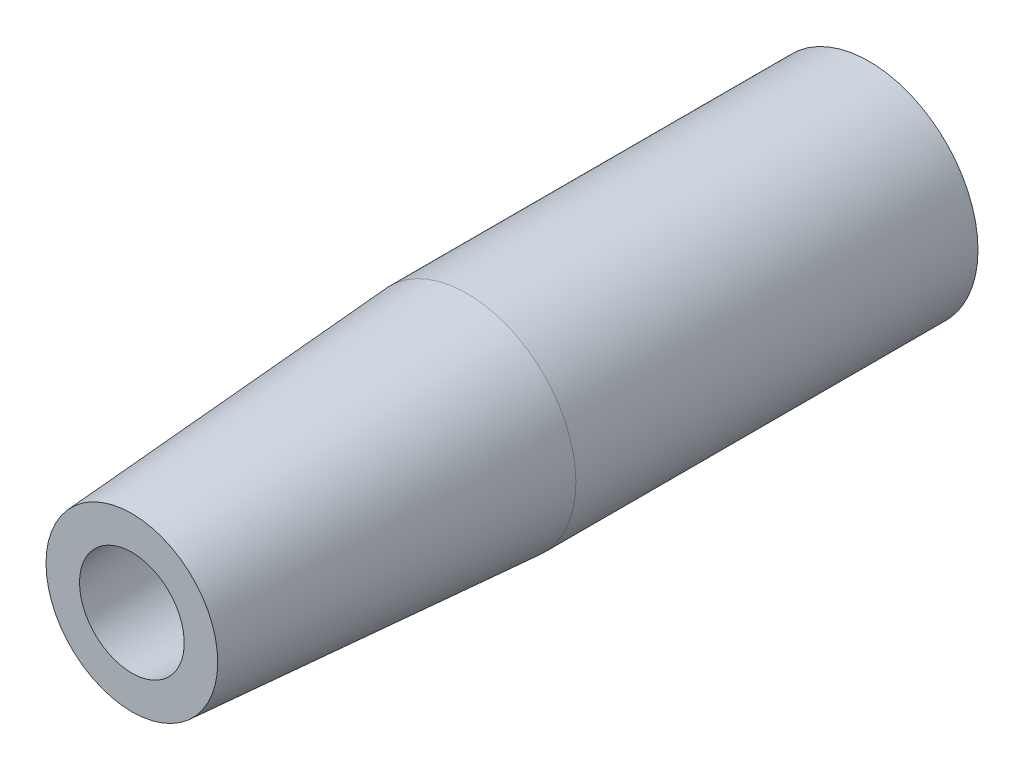
ISO-10303-21;
HEADER;
FILE_DESCRIPTION(('STEP AP214'),'2;1');
FILE_NAME('part.step','',(''),(''),'','','');
FILE_SCHEMA(('AUTOMOTIVE_DESIGN { 1 0 10303 214 1 1 1 1 }'));
ENDSEC;
DATA;
#1=APPLICATION_CONTEXT('core data for automotive mechanical design processes');
#2=APPLICATION_PROTOCOL_DEFINITION('international standard','automotive_design',2000,#1);
#3=PRODUCT_CONTEXT('',#1,'mechanical');
#4=PRODUCT('Part','Part','',(#3));
#5=PRODUCT_RELATED_PRODUCT_CATEGORY('part','',(#4));
#6=PRODUCT_DEFINITION_FORMATION('','',#4);
#7=PRODUCT_DEFINITION_CONTEXT('part definition',#1,'design');
#8=PRODUCT_DEFINITION('design','',#6,#7);
#9=PRODUCT_DEFINITION_SHAPE('','',#8);
#10=(LENGTH_UNIT() NAMED_UNIT(*) SI_UNIT(.MILLI.,.METRE.));
#11=(NAMED_UNIT(*) PLANE_ANGLE_UNIT() SI_UNIT($,.RADIAN.));
#12=(NAMED_UNIT(*) SI_UNIT($,.STERADIAN.) SOLID_ANGLE_UNIT());
#13=UNCERTAINTY_MEASURE_WITH_UNIT(LENGTH_MEASURE(1.E-05),#10,'distance_accuracy_value','');
#14=(GEOMETRIC_REPRESENTATION_CONTEXT(3) GLOBAL_UNCERTAINTY_ASSIGNED_CONTEXT((#13)) GLOBAL_UNIT_ASSIGNED_CONTEXT((#10,
#11,#12)) REPRESENTATION_CONTEXT('',''));
#15=CARTESIAN_POINT('',(0.,0.,0.));
#16=DIRECTION('',(0.,0.,1.));
#17=DIRECTION('',(1.,0.,0.));
#18=AXIS2_PLACEMENT_3D('',#15,#16,#17);
#19=CARTESIAN_POINT('',(0.,0.,0.));
#20=DIRECTION('',(0.,0.,1.));
#21=DIRECTION('',(1.,0.,0.));
#22=AXIS2_PLACEMENT_3D('',#19,#20,#21);
#23=PLANE('',#22);
#24=CARTESIAN_POINT('',(0.,0.,0.));
#25=DIRECTION('',(0.,0.,1.));
#26=DIRECTION('',(1.,0.,0.));
#27=AXIS2_PLACEMENT_3D('',#24,#25,#26);
#28=CIRCLE('',#27,32.5);
#29=CARTESIAN_POINT('',(32.5,0.,0.));
#30=VERTEX_POINT('',#29);
#31=EDGE_CURVE('E47',#30,#30,#28,.T.);
#32=ORIENTED_EDGE('',*,*,#31,.F.);
#33=EDGE_LOOP('',(#32));
#34=FACE_BOUND('',#33,.T.);
#35=CARTESIAN_POINT('',(0.,0.,0.));
#36=DIRECTION('',(0.,0.,1.));
#37=DIRECTION('',(1.,0.,0.));
#38=AXIS2_PLACEMENT_3D('',#35,#36,#37);
#39=CIRCLE('',#38,22.5);
#40=CARTESIAN_POINT('',(22.5,0.,0.));
#41=VERTEX_POINT('',#40);
#42=EDGE_CURVE('E56',#41,#41,#39,.T.);
#43=ORIENTED_EDGE('',*,*,#42,.T.);
#44=EDGE_LOOP('',(#43));
#45=FACE_BOUND('',#44,.T.);
#46=ADVANCED_FACE('F43',(#34,#45),#23,.F.);
#47=CARTESIAN_POINT('',(0.,0.,120.));
#48=DIRECTION('',(0.,0.,-1.));
#49=DIRECTION('',(-1.,0.,0.));
#50=AXIS2_PLACEMENT_3D('',#47,#48,#49);
#51=CYLINDRICAL_SURFACE('',#50,32.5);
#52=CARTESIAN_POINT('',(0.,0.,120.));
#53=DIRECTION('',(0.,0.,1.));
#54=DIRECTION('',(1.,0.,0.));
#55=AXIS2_PLACEMENT_3D('',#52,#53,#54);
#56=CIRCLE('',#55,32.5);
#57=CARTESIAN_POINT('',(32.5,0.,120.));
#58=VERTEX_POINT('',#57);
#59=EDGE_CURVE('E10',#58,#58,#56,.T.);
#60=ORIENTED_EDGE('',*,*,#59,.F.);
#61=EDGE_LOOP('',(#60));
#62=FACE_BOUND('',#61,.T.);
#63=ORIENTED_EDGE('',*,*,#31,.T.);
#64=EDGE_LOOP('',(#63));
#65=FACE_BOUND('',#64,.T.);
#66=ADVANCED_FACE('F45',(#62,#65),#51,.T.);
#67=CARTESIAN_POINT('',(0.,0.,120.));
#68=DIRECTION('',(0.,0.,-1.));
#69=DIRECTION('',(-1.,0.,0.));
#70=AXIS2_PLACEMENT_3D('',#67,#68,#69);
#71=CYLINDRICAL_SURFACE('',#70,22.5);
#72=CARTESIAN_POINT('',(0.,0.,120.));
#73=DIRECTION('',(0.,0.,-1.));
#74=DIRECTION('',(-1.,0.,0.));
#75=AXIS2_PLACEMENT_3D('',#72,#73,#74);
#76=CIRCLE('',#75,22.5);
#77=CARTESIAN_POINT('',(-22.5,0.,120.));
#78=VERTEX_POINT('',#77);
#79=EDGE_CURVE('E69',#78,#78,#76,.T.);
#80=ORIENTED_EDGE('',*,*,#79,.F.);
#81=EDGE_LOOP('',(#80));
#82=FACE_BOUND('',#81,.T.);
#83=ORIENTED_EDGE('',*,*,#42,.F.);
#84=EDGE_LOOP('',(#83));
#85=FACE_BOUND('',#84,.T.);
#86=ADVANCED_FACE('F77',(#82,#85),#71,.F.);
#87=CARTESIAN_POINT('',(0.,0.,120.));
#88=DIRECTION('',(0.,0.,-1.));
#89=DIRECTION('',(-1.,0.,0.));
#90=AXIS2_PLACEMENT_3D('',#87,#88,#89);
#91=CONICAL_SURFACE('',#90,32.5,0.0686419890898341);
#92=CARTESIAN_POINT('',(0.,0.,220.));
#93=DIRECTION('',(0.,0.,-1.));
#94=DIRECTION('',(-1.,0.,0.));
#95=AXIS2_PLACEMENT_3D('',#92,#93,#94);
#96=CIRCLE('',#95,25.625);
#97=CARTESIAN_POINT('',(-25.625,0.,220.));
#98=VERTEX_POINT('',#97);
#99=EDGE_CURVE('E61',#98,#98,#96,.T.);
#100=ORIENTED_EDGE('',*,*,#99,.T.);
#101=EDGE_LOOP('',(#100));
#102=FACE_BOUND('',#101,.T.);
#103=ORIENTED_EDGE('',*,*,#59,.T.);
#104=EDGE_LOOP('',(#103));
#105=FACE_BOUND('',#104,.T.);
#106=ADVANCED_FACE('F80',(#102,#105),#91,.T.);
#107=CARTESIAN_POINT('',(0.,15.625,220.));
#108=DIRECTION('',(0.,0.,1.));
#109=DIRECTION('',(1.,0.,0.));
#110=AXIS2_PLACEMENT_3D('',#107,#108,#109);
#111=PLANE('',#110);
#112=CARTESIAN_POINT('',(0.,0.,220.));
#113=DIRECTION('',(0.,0.,-1.));
#114=DIRECTION('',(-1.,0.,0.));
#115=AXIS2_PLACEMENT_3D('',#112,#113,#114);
#116=CIRCLE('',#115,15.625);
#117=CARTESIAN_POINT('',(-15.625,0.,220.));
#118=VERTEX_POINT('',#117);
#119=EDGE_CURVE('E65',#118,#118,#116,.T.);
#120=ORIENTED_EDGE('',*,*,#119,.T.);
#121=EDGE_LOOP('',(#120));
#122=FACE_BOUND('',#121,.T.);
#123=ORIENTED_EDGE('',*,*,#99,.F.);
#124=EDGE_LOOP('',(#123));
#125=FACE_BOUND('',#124,.T.);
#126=ADVANCED_FACE('F94',(#122,#125),#111,.T.);
#127=CARTESIAN_POINT('',(0.,0.,220.));
#128=DIRECTION('',(0.,0.,-1.));
#129=DIRECTION('',(-1.,0.,0.));
#130=AXIS2_PLACEMENT_3D('',#127,#128,#129);
#131=CONICAL_SURFACE('',#130,15.625,0.0686419890898341);
#132=ORIENTED_EDGE('',*,*,#79,.T.);
#133=EDGE_LOOP('',(#132));
#134=FACE_BOUND('',#133,.T.);
#135=ORIENTED_EDGE('',*,*,#119,.F.);
#136=EDGE_LOOP('',(#135));
#137=FACE_BOUND('',#136,.T.);
#138=ADVANCED_FACE('F74',(#134,#137),#131,.F.);
#139=CLOSED_SHELL('',(#46,#66,#86,#106,#126,#138));
#140=MANIFOLD_SOLID_BREP('B2',#139);
#141=ADVANCED_BREP_SHAPE_REPRESENTATION('',(#18,#140),#14);
#142=SHAPE_DEFINITION_REPRESENTATION(#9,#141);
ENDSEC;
END-ISO-10303-21;
